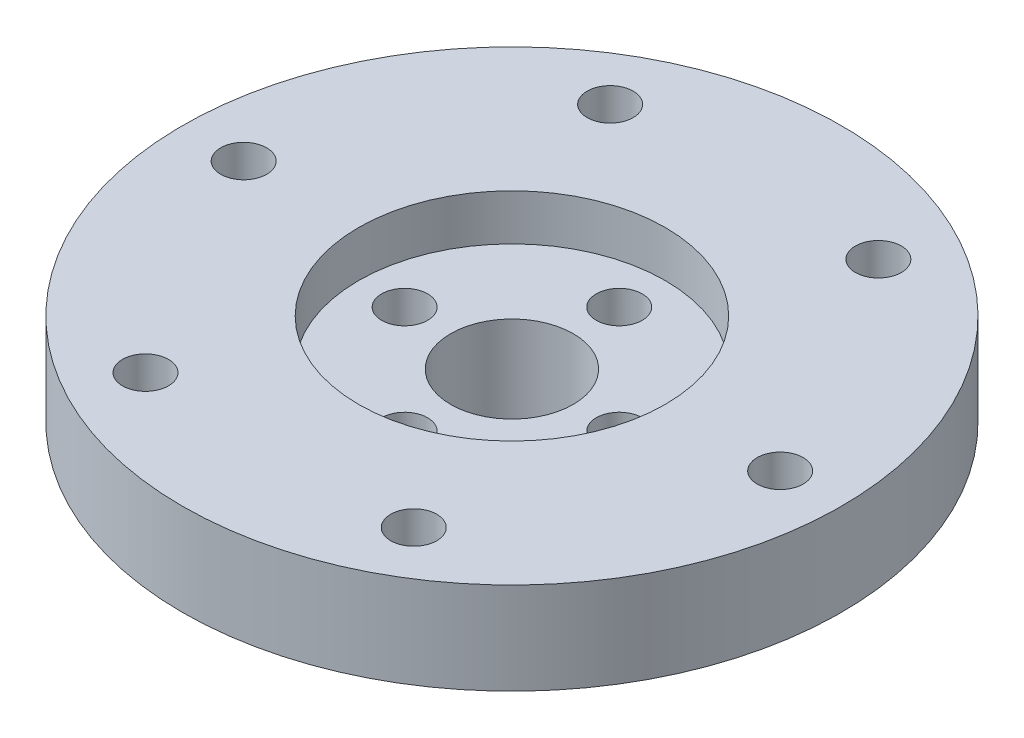
ISO-10303-21;
HEADER;
FILE_DESCRIPTION(('STEP AP214'),'2;1');
FILE_NAME('part.step','',(''),(''),'','','');
FILE_SCHEMA(('AUTOMOTIVE_DESIGN { 1 0 10303 214 1 1 1 1 }'));
ENDSEC;
DATA;
#1=APPLICATION_CONTEXT('core data for automotive mechanical design processes');
#2=APPLICATION_PROTOCOL_DEFINITION('international standard','automotive_design',2000,#1);
#3=PRODUCT_CONTEXT('',#1,'mechanical');
#4=PRODUCT('Part','Part','',(#3));
#5=PRODUCT_RELATED_PRODUCT_CATEGORY('part','',(#4));
#6=PRODUCT_DEFINITION_FORMATION('','',#4);
#7=PRODUCT_DEFINITION_CONTEXT('part definition',#1,'design');
#8=PRODUCT_DEFINITION('design','',#6,#7);
#9=PRODUCT_DEFINITION_SHAPE('','',#8);
#10=(LENGTH_UNIT() NAMED_UNIT(*) SI_UNIT(.MILLI.,.METRE.));
#11=(NAMED_UNIT(*) PLANE_ANGLE_UNIT() SI_UNIT($,.RADIAN.));
#12=(NAMED_UNIT(*) SI_UNIT($,.STERADIAN.) SOLID_ANGLE_UNIT());
#13=UNCERTAINTY_MEASURE_WITH_UNIT(LENGTH_MEASURE(1.E-05),#10,'distance_accuracy_value','');
#14=(GEOMETRIC_REPRESENTATION_CONTEXT(3) GLOBAL_UNCERTAINTY_ASSIGNED_CONTEXT((#13)) GLOBAL_UNIT_ASSIGNED_CONTEXT((#10,
#11,#12)) REPRESENTATION_CONTEXT('',''));
#15=CARTESIAN_POINT('',(0.,0.,0.));
#16=DIRECTION('',(0.,0.,1.));
#17=DIRECTION('',(1.,0.,0.));
#18=AXIS2_PLACEMENT_3D('',#15,#16,#17);
#19=CARTESIAN_POINT('',(0.,0.,0.));
#20=DIRECTION('',(0.,1.,0.));
#21=DIRECTION('',(0.,0.,1.));
#22=AXIS2_PLACEMENT_3D('',#19,#20,#21);
#23=PLANE('',#22);
#24=CARTESIAN_POINT('',(-8.74999999999996,0.,15.1554445662277));
#25=DIRECTION('',(0.,1.,0.));
#26=DIRECTION('',(0.,0.,1.));
#27=AXIS2_PLACEMENT_3D('',#24,#25,#26);
#28=CIRCLE('',#27,1.49999999999999);
#29=CARTESIAN_POINT('',(-8.74999999999996,0.,16.6554445662277));
#30=VERTEX_POINT('',#29);
#31=EDGE_CURVE('E97',#30,#30,#28,.T.);
#32=ORIENTED_EDGE('',*,*,#31,.T.);
#33=EDGE_LOOP('',(#32));
#34=FACE_BOUND('',#33,.T.);
#35=CARTESIAN_POINT('',(8.74999999999996,0.,15.1554445662277));
#36=DIRECTION('',(0.,1.,0.));
#37=DIRECTION('',(0.,0.,-1.));
#38=AXIS2_PLACEMENT_3D('',#35,#36,#37);
#39=CIRCLE('',#38,1.49999999999999);
#40=CARTESIAN_POINT('',(8.74999999999996,0.,13.6554445662277));
#41=VERTEX_POINT('',#40);
#42=EDGE_CURVE('E93',#41,#41,#39,.T.);
#43=ORIENTED_EDGE('',*,*,#42,.T.);
#44=EDGE_LOOP('',(#43));
#45=FACE_BOUND('',#44,.T.);
#46=CARTESIAN_POINT('',(-8.74999999999996,0.,-15.1554445662277));
#47=DIRECTION('',(0.,1.,0.));
#48=DIRECTION('',(0.,0.,-1.));
#49=AXIS2_PLACEMENT_3D('',#46,#47,#48);
#50=CIRCLE('',#49,1.5);
#51=CARTESIAN_POINT('',(-8.74999999999996,0.,-16.6554445662277));
#52=VERTEX_POINT('',#51);
#53=EDGE_CURVE('E89',#52,#52,#50,.T.);
#54=ORIENTED_EDGE('',*,*,#53,.T.);
#55=EDGE_LOOP('',(#54));
#56=FACE_BOUND('',#55,.T.);
#57=CARTESIAN_POINT('',(-17.5,0.,0.));
#58=DIRECTION('',(0.,1.,0.));
#59=DIRECTION('',(0.,0.,-1.));
#60=AXIS2_PLACEMENT_3D('',#57,#58,#59);
#61=CIRCLE('',#60,1.5);
#62=CARTESIAN_POINT('',(-17.5,0.,-1.5));
#63=VERTEX_POINT('',#62);
#64=EDGE_CURVE('E85',#63,#63,#61,.T.);
#65=ORIENTED_EDGE('',*,*,#64,.T.);
#66=EDGE_LOOP('',(#65));
#67=FACE_BOUND('',#66,.T.);
#68=CARTESIAN_POINT('',(17.5,0.,0.));
#69=DIRECTION('',(0.,1.,0.));
#70=DIRECTION('',(0.,0.,1.));
#71=AXIS2_PLACEMENT_3D('',#68,#69,#70);
#72=CIRCLE('',#71,1.5);
#73=CARTESIAN_POINT('',(17.5,0.,1.5));
#74=VERTEX_POINT('',#73);
#75=EDGE_CURVE('E81',#74,#74,#72,.T.);
#76=ORIENTED_EDGE('',*,*,#75,.T.);
#77=EDGE_LOOP('',(#76));
#78=FACE_BOUND('',#77,.T.);
#79=CARTESIAN_POINT('',(8.74999999999996,0.,-15.1554445662277));
#80=DIRECTION('',(0.,1.,0.));
#81=DIRECTION('',(0.,0.,1.));
#82=AXIS2_PLACEMENT_3D('',#79,#80,#81);
#83=CIRCLE('',#82,1.5);
#84=CARTESIAN_POINT('',(8.74999999999996,0.,-13.6554445662277));
#85=VERTEX_POINT('',#84);
#86=EDGE_CURVE('E77',#85,#85,#83,.T.);
#87=ORIENTED_EDGE('',*,*,#86,.T.);
#88=EDGE_LOOP('',(#87));
#89=FACE_BOUND('',#88,.T.);
#90=CARTESIAN_POINT('',(0.,0.,0.));
#91=DIRECTION('',(0.,1.,0.));
#92=DIRECTION('',(0.,0.,1.));
#93=AXIS2_PLACEMENT_3D('',#90,#91,#92);
#94=CIRCLE('',#93,21.5);
#95=CARTESIAN_POINT('',(0.,0.,21.5));
#96=VERTEX_POINT('',#95);
#97=EDGE_CURVE('E49',#96,#96,#94,.T.);
#98=ORIENTED_EDGE('',*,*,#97,.F.);
#99=EDGE_LOOP('',(#98));
#100=FACE_BOUND('',#99,.T.);
#101=CARTESIAN_POINT('',(0.,0.,0.));
#102=DIRECTION('',(0.,1.,0.));
#103=DIRECTION('',(0.,0.,1.));
#104=AXIS2_PLACEMENT_3D('',#101,#102,#103);
#105=CIRCLE('',#104,14.);
#106=CARTESIAN_POINT('',(0.,0.,14.));
#107=VERTEX_POINT('',#106);
#108=EDGE_CURVE('E10',#107,#107,#105,.F.);
#109=ORIENTED_EDGE('',*,*,#108,.F.);
#110=EDGE_LOOP('',(#109));
#111=FACE_BOUND('',#110,.T.);
#112=ADVANCED_FACE('F41',(#34,#45,#56,#67,#78,#89,#100,#111),#23,.F.);
#113=CARTESIAN_POINT('',(0.,3.,0.));
#114=DIRECTION('',(0.,1.,0.));
#115=DIRECTION('',(0.,0.,1.));
#116=AXIS2_PLACEMENT_3D('',#113,#114,#115);
#117=PLANE('',#116);
#118=CARTESIAN_POINT('',(-7.,3.,0.));
#119=DIRECTION('',(0.,1.,0.));
#120=DIRECTION('',(0.,0.,-1.));
#121=AXIS2_PLACEMENT_3D('',#118,#119,#120);
#122=CIRCLE('',#121,1.5);
#123=CARTESIAN_POINT('',(-7.,3.,-1.5));
#124=VERTEX_POINT('',#123);
#125=EDGE_CURVE('E73',#124,#124,#122,.T.);
#126=ORIENTED_EDGE('',*,*,#125,.F.);
#127=EDGE_LOOP('',(#126));
#128=FACE_BOUND('',#127,.T.);
#129=CARTESIAN_POINT('',(7.,3.,0.));
#130=DIRECTION('',(0.,1.,0.));
#131=DIRECTION('',(0.,0.,1.));
#132=AXIS2_PLACEMENT_3D('',#129,#130,#131);
#133=CIRCLE('',#132,1.5);
#134=CARTESIAN_POINT('',(7.,3.,1.5));
#135=VERTEX_POINT('',#134);
#136=EDGE_CURVE('E65',#135,#135,#133,.T.);
#137=ORIENTED_EDGE('',*,*,#136,.F.);
#138=EDGE_LOOP('',(#137));
#139=FACE_BOUND('',#138,.T.);
#140=CARTESIAN_POINT('',(0.,3.,0.));
#141=DIRECTION('',(0.,1.,0.));
#142=DIRECTION('',(0.,0.,1.));
#143=AXIS2_PLACEMENT_3D('',#140,#141,#142);
#144=CIRCLE('',#143,4.);
#145=CARTESIAN_POINT('',(0.,3.,4.));
#146=VERTEX_POINT('',#145);
#147=EDGE_CURVE('E54',#146,#146,#144,.T.);
#148=ORIENTED_EDGE('',*,*,#147,.F.);
#149=EDGE_LOOP('',(#148));
#150=FACE_BOUND('',#149,.T.);
#151=CARTESIAN_POINT('',(0.,3.,-7.));
#152=DIRECTION('',(0.,1.,0.));
#153=DIRECTION('',(0.,0.,1.));
#154=AXIS2_PLACEMENT_3D('',#151,#152,#153);
#155=CIRCLE('',#154,1.5);
#156=CARTESIAN_POINT('',(0.,3.,-5.5));
#157=VERTEX_POINT('',#156);
#158=EDGE_CURVE('E59',#157,#157,#155,.T.);
#159=ORIENTED_EDGE('',*,*,#158,.F.);
#160=EDGE_LOOP('',(#159));
#161=FACE_BOUND('',#160,.T.);
#162=CARTESIAN_POINT('',(0.,3.,7.));
#163=DIRECTION('',(0.,1.,0.));
#164=DIRECTION('',(0.,0.,-1.));
#165=AXIS2_PLACEMENT_3D('',#162,#163,#164);
#166=CIRCLE('',#165,1.5);
#167=CARTESIAN_POINT('',(0.,3.,5.5));
#168=VERTEX_POINT('',#167);
#169=EDGE_CURVE('E69',#168,#168,#166,.T.);
#170=ORIENTED_EDGE('',*,*,#169,.F.);
#171=EDGE_LOOP('',(#170));
#172=FACE_BOUND('',#171,.T.);
#173=CARTESIAN_POINT('',(0.,3.,0.));
#174=DIRECTION('',(0.,1.,0.));
#175=DIRECTION('',(0.,0.,1.));
#176=AXIS2_PLACEMENT_3D('',#173,#174,#175);
#177=CIRCLE('',#176,10.);
#178=CARTESIAN_POINT('',(0.,3.,10.));
#179=VERTEX_POINT('',#178);
#180=EDGE_CURVE('E130',#179,#179,#177,.T.);
#181=ORIENTED_EDGE('',*,*,#180,.T.);
#182=EDGE_LOOP('',(#181));
#183=FACE_BOUND('',#182,.T.);
#184=ADVANCED_FACE('F182',(#128,#139,#150,#161,#172,#183),#117,.T.);
#185=CARTESIAN_POINT('',(0.,3.,0.));
#186=DIRECTION('',(0.,-1.,0.));
#187=DIRECTION('',(0.,0.,-1.));
#188=AXIS2_PLACEMENT_3D('',#185,#186,#187);
#189=CYLINDRICAL_SURFACE('',#188,21.5);
#190=ORIENTED_EDGE('',*,*,#97,.T.);
#191=EDGE_LOOP('',(#190));
#192=FACE_BOUND('',#191,.T.);
#193=CARTESIAN_POINT('',(0.,6.,0.));
#194=DIRECTION('',(0.,1.,0.));
#195=DIRECTION('',(0.,0.,1.));
#196=AXIS2_PLACEMENT_3D('',#193,#194,#195);
#197=CIRCLE('',#196,21.5);
#198=CARTESIAN_POINT('',(0.,6.,21.5));
#199=VERTEX_POINT('',#198);
#200=EDGE_CURVE('E101',#199,#199,#197,.T.);
#201=ORIENTED_EDGE('',*,*,#200,.F.);
#202=EDGE_LOOP('',(#201));
#203=FACE_BOUND('',#202,.T.);
#204=ADVANCED_FACE('F43',(#192,#203),#189,.T.);
#205=CARTESIAN_POINT('',(0.,3.,0.));
#206=DIRECTION('',(0.,-1.,0.));
#207=DIRECTION('',(0.,0.,-1.));
#208=AXIS2_PLACEMENT_3D('',#205,#206,#207);
#209=CYLINDRICAL_SURFACE('',#208,4.);
#210=ORIENTED_EDGE('',*,*,#147,.T.);
#211=EDGE_LOOP('',(#210));
#212=FACE_BOUND('',#211,.T.);
#213=CARTESIAN_POINT('',(0.,-3.,0.));
#214=DIRECTION('',(0.,-1.,0.));
#215=DIRECTION('',(0.,0.,-1.));
#216=AXIS2_PLACEMENT_3D('',#213,#214,#215);
#217=CIRCLE('',#216,4.);
#218=CARTESIAN_POINT('',(0.,-3.,-4.));
#219=VERTEX_POINT('',#218);
#220=EDGE_CURVE('E145',#219,#219,#217,.T.);
#221=ORIENTED_EDGE('',*,*,#220,.T.);
#222=EDGE_LOOP('',(#221));
#223=FACE_BOUND('',#222,.T.);
#224=ADVANCED_FACE('F191',(#212,#223),#209,.F.);
#225=CARTESIAN_POINT('',(0.,3.,-7.));
#226=DIRECTION('',(0.,-1.,0.));
#227=DIRECTION('',(0.,0.,-1.));
#228=AXIS2_PLACEMENT_3D('',#225,#226,#227);
#229=CYLINDRICAL_SURFACE('',#228,1.5);
#230=ORIENTED_EDGE('',*,*,#158,.T.);
#231=EDGE_LOOP('',(#230));
#232=FACE_BOUND('',#231,.T.);
#233=CARTESIAN_POINT('',(0.,-3.,-7.));
#234=DIRECTION('',(0.,-1.,0.));
#235=DIRECTION('',(0.,0.,-1.));
#236=AXIS2_PLACEMENT_3D('',#233,#234,#235);
#237=CIRCLE('',#236,1.5);
#238=CARTESIAN_POINT('',(0.,-3.,-8.5));
#239=VERTEX_POINT('',#238);
#240=EDGE_CURVE('E149',#239,#239,#237,.T.);
#241=ORIENTED_EDGE('',*,*,#240,.T.);
#242=EDGE_LOOP('',(#241));
#243=FACE_BOUND('',#242,.T.);
#244=ADVANCED_FACE('F194',(#232,#243),#229,.F.);
#245=CARTESIAN_POINT('',(7.,3.,0.));
#246=DIRECTION('',(0.,-1.,0.));
#247=DIRECTION('',(0.,0.,-1.));
#248=AXIS2_PLACEMENT_3D('',#245,#246,#247);
#249=CYLINDRICAL_SURFACE('',#248,1.5);
#250=ORIENTED_EDGE('',*,*,#136,.T.);
#251=EDGE_LOOP('',(#250));
#252=FACE_BOUND('',#251,.T.);
#253=CARTESIAN_POINT('',(7.,-3.,0.));
#254=DIRECTION('',(0.,-1.,0.));
#255=DIRECTION('',(0.,0.,-1.));
#256=AXIS2_PLACEMENT_3D('',#253,#254,#255);
#257=CIRCLE('',#256,1.5);
#258=CARTESIAN_POINT('',(7.,-3.,-1.5));
#259=VERTEX_POINT('',#258);
#260=EDGE_CURVE('E141',#259,#259,#257,.T.);
#261=ORIENTED_EDGE('',*,*,#260,.T.);
#262=EDGE_LOOP('',(#261));
#263=FACE_BOUND('',#262,.T.);
#264=ADVANCED_FACE('F198',(#252,#263),#249,.F.);
#265=CARTESIAN_POINT('',(0.,3.,7.));
#266=DIRECTION('',(0.,-1.,0.));
#267=DIRECTION('',(0.,0.,-1.));
#268=AXIS2_PLACEMENT_3D('',#265,#266,#267);
#269=CYLINDRICAL_SURFACE('',#268,1.5);
#270=ORIENTED_EDGE('',*,*,#169,.T.);
#271=EDGE_LOOP('',(#270));
#272=FACE_BOUND('',#271,.T.);
#273=CARTESIAN_POINT('',(0.,-3.,7.));
#274=DIRECTION('',(0.,-1.,0.));
#275=DIRECTION('',(0.,0.,-1.));
#276=AXIS2_PLACEMENT_3D('',#273,#274,#275);
#277=CIRCLE('',#276,1.5);
#278=CARTESIAN_POINT('',(0.,-3.,5.5));
#279=VERTEX_POINT('',#278);
#280=EDGE_CURVE('E157',#279,#279,#277,.T.);
#281=ORIENTED_EDGE('',*,*,#280,.T.);
#282=EDGE_LOOP('',(#281));
#283=FACE_BOUND('',#282,.T.);
#284=ADVANCED_FACE('F162',(#272,#283),#269,.F.);
#285=CARTESIAN_POINT('',(-7.,3.,0.));
#286=DIRECTION('',(0.,-1.,0.));
#287=DIRECTION('',(0.,0.,-1.));
#288=AXIS2_PLACEMENT_3D('',#285,#286,#287);
#289=CYLINDRICAL_SURFACE('',#288,1.5);
#290=ORIENTED_EDGE('',*,*,#125,.T.);
#291=EDGE_LOOP('',(#290));
#292=FACE_BOUND('',#291,.T.);
#293=CARTESIAN_POINT('',(-7.,-3.,0.));
#294=DIRECTION('',(0.,-1.,0.));
#295=DIRECTION('',(0.,0.,-1.));
#296=AXIS2_PLACEMENT_3D('',#293,#294,#295);
#297=CIRCLE('',#296,1.5);
#298=CARTESIAN_POINT('',(-7.,-3.,-1.5));
#299=VERTEX_POINT('',#298);
#300=EDGE_CURVE('E153',#299,#299,#297,.T.);
#301=ORIENTED_EDGE('',*,*,#300,.T.);
#302=EDGE_LOOP('',(#301));
#303=FACE_BOUND('',#302,.T.);
#304=ADVANCED_FACE('F205',(#292,#303),#289,.F.);
#305=CARTESIAN_POINT('',(8.74999999999996,3.,-15.1554445662277));
#306=DIRECTION('',(0.,-1.,0.));
#307=DIRECTION('',(0.,0.,-1.));
#308=AXIS2_PLACEMENT_3D('',#305,#306,#307);
#309=CYLINDRICAL_SURFACE('',#308,1.5);
#310=ORIENTED_EDGE('',*,*,#86,.F.);
#311=EDGE_LOOP('',(#310));
#312=FACE_BOUND('',#311,.T.);
#313=CARTESIAN_POINT('',(8.74999999999996,6.,-15.1554445662277));
#314=DIRECTION('',(0.,1.,0.));
#315=DIRECTION('',(0.,0.,1.));
#316=AXIS2_PLACEMENT_3D('',#313,#314,#315);
#317=CIRCLE('',#316,1.5);
#318=CARTESIAN_POINT('',(8.74999999999996,6.,-13.6554445662277));
#319=VERTEX_POINT('',#318);
#320=EDGE_CURVE('E121',#319,#319,#317,.T.);
#321=ORIENTED_EDGE('',*,*,#320,.T.);
#322=EDGE_LOOP('',(#321));
#323=FACE_BOUND('',#322,.T.);
#324=ADVANCED_FACE('F209',(#312,#323),#309,.F.);
#325=CARTESIAN_POINT('',(17.5,3.,0.));
#326=DIRECTION('',(0.,-1.,0.));
#327=DIRECTION('',(0.,0.,-1.));
#328=AXIS2_PLACEMENT_3D('',#325,#326,#327);
#329=CYLINDRICAL_SURFACE('',#328,1.5);
#330=ORIENTED_EDGE('',*,*,#75,.F.);
#331=EDGE_LOOP('',(#330));
#332=FACE_BOUND('',#331,.T.);
#333=CARTESIAN_POINT('',(17.5,6.,0.));
#334=DIRECTION('',(0.,1.,0.));
#335=DIRECTION('',(0.,0.,1.));
#336=AXIS2_PLACEMENT_3D('',#333,#334,#335);
#337=CIRCLE('',#336,1.5);
#338=CARTESIAN_POINT('',(17.5,6.,1.5));
#339=VERTEX_POINT('',#338);
#340=EDGE_CURVE('E117',#339,#339,#337,.T.);
#341=ORIENTED_EDGE('',*,*,#340,.T.);
#342=EDGE_LOOP('',(#341));
#343=FACE_BOUND('',#342,.T.);
#344=ADVANCED_FACE('F213',(#332,#343),#329,.F.);
#345=CARTESIAN_POINT('',(-17.5,3.,0.));
#346=DIRECTION('',(0.,-1.,0.));
#347=DIRECTION('',(0.,0.,-1.));
#348=AXIS2_PLACEMENT_3D('',#345,#346,#347);
#349=CYLINDRICAL_SURFACE('',#348,1.5);
#350=ORIENTED_EDGE('',*,*,#64,.F.);
#351=EDGE_LOOP('',(#350));
#352=FACE_BOUND('',#351,.T.);
#353=CARTESIAN_POINT('',(-17.5,6.,0.));
#354=DIRECTION('',(0.,1.,0.));
#355=DIRECTION('',(0.,0.,1.));
#356=AXIS2_PLACEMENT_3D('',#353,#354,#355);
#357=CIRCLE('',#356,1.5);
#358=CARTESIAN_POINT('',(-17.5,6.,1.5));
#359=VERTEX_POINT('',#358);
#360=EDGE_CURVE('E105',#359,#359,#357,.T.);
#361=ORIENTED_EDGE('',*,*,#360,.T.);
#362=EDGE_LOOP('',(#361));
#363=FACE_BOUND('',#362,.T.);
#364=ADVANCED_FACE('F217',(#352,#363),#349,.F.);
#365=CARTESIAN_POINT('',(-8.74999999999996,3.,-15.1554445662277));
#366=DIRECTION('',(0.,-1.,0.));
#367=DIRECTION('',(0.,0.,-1.));
#368=AXIS2_PLACEMENT_3D('',#365,#366,#367);
#369=CYLINDRICAL_SURFACE('',#368,1.5);
#370=ORIENTED_EDGE('',*,*,#53,.F.);
#371=EDGE_LOOP('',(#370));
#372=FACE_BOUND('',#371,.T.);
#373=CARTESIAN_POINT('',(-8.74999999999996,6.,-15.1554445662277));
#374=DIRECTION('',(0.,1.,0.));
#375=DIRECTION('',(0.,0.,1.));
#376=AXIS2_PLACEMENT_3D('',#373,#374,#375);
#377=CIRCLE('',#376,1.5);
#378=CARTESIAN_POINT('',(-8.74999999999996,6.,-13.6554445662277));
#379=VERTEX_POINT('',#378);
#380=EDGE_CURVE('E125',#379,#379,#377,.T.);
#381=ORIENTED_EDGE('',*,*,#380,.T.);
#382=EDGE_LOOP('',(#381));
#383=FACE_BOUND('',#382,.T.);
#384=ADVANCED_FACE('F221',(#372,#383),#369,.F.);
#385=CARTESIAN_POINT('',(8.74999999999996,3.,15.1554445662277));
#386=DIRECTION('',(0.,-1.,0.));
#387=DIRECTION('',(0.,0.,-1.));
#388=AXIS2_PLACEMENT_3D('',#385,#386,#387);
#389=CYLINDRICAL_SURFACE('',#388,1.49999999999999);
#390=ORIENTED_EDGE('',*,*,#42,.F.);
#391=EDGE_LOOP('',(#390));
#392=FACE_BOUND('',#391,.T.);
#393=CARTESIAN_POINT('',(8.74999999999996,6.,15.1554445662277));
#394=DIRECTION('',(0.,1.,0.));
#395=DIRECTION('',(0.,0.,1.));
#396=AXIS2_PLACEMENT_3D('',#393,#394,#395);
#397=CIRCLE('',#396,1.49999999999999);
#398=CARTESIAN_POINT('',(8.74999999999996,6.,16.6554445662277));
#399=VERTEX_POINT('',#398);
#400=EDGE_CURVE('E113',#399,#399,#397,.T.);
#401=ORIENTED_EDGE('',*,*,#400,.T.);
#402=EDGE_LOOP('',(#401));
#403=FACE_BOUND('',#402,.T.);
#404=ADVANCED_FACE('F225',(#392,#403),#389,.F.);
#405=CARTESIAN_POINT('',(-8.74999999999996,3.,15.1554445662277));
#406=DIRECTION('',(0.,-1.,0.));
#407=DIRECTION('',(0.,0.,-1.));
#408=AXIS2_PLACEMENT_3D('',#405,#406,#407);
#409=CYLINDRICAL_SURFACE('',#408,1.49999999999999);
#410=ORIENTED_EDGE('',*,*,#31,.F.);
#411=EDGE_LOOP('',(#410));
#412=FACE_BOUND('',#411,.T.);
#413=CARTESIAN_POINT('',(-8.74999999999996,6.,15.1554445662277));
#414=DIRECTION('',(0.,1.,0.));
#415=DIRECTION('',(0.,0.,1.));
#416=AXIS2_PLACEMENT_3D('',#413,#414,#415);
#417=CIRCLE('',#416,1.49999999999999);
#418=CARTESIAN_POINT('',(-8.74999999999996,6.,16.6554445662277));
#419=VERTEX_POINT('',#418);
#420=EDGE_CURVE('E109',#419,#419,#417,.T.);
#421=ORIENTED_EDGE('',*,*,#420,.T.);
#422=EDGE_LOOP('',(#421));
#423=FACE_BOUND('',#422,.T.);
#424=ADVANCED_FACE('F229',(#412,#423),#409,.F.);
#425=CARTESIAN_POINT('',(0.,6.,0.));
#426=DIRECTION('',(0.,1.,0.));
#427=DIRECTION('',(0.,0.,1.));
#428=AXIS2_PLACEMENT_3D('',#425,#426,#427);
#429=PLANE('',#428);
#430=ORIENTED_EDGE('',*,*,#380,.F.);
#431=EDGE_LOOP('',(#430));
#432=FACE_BOUND('',#431,.T.);
#433=ORIENTED_EDGE('',*,*,#340,.F.);
#434=EDGE_LOOP('',(#433));
#435=FACE_BOUND('',#434,.T.);
#436=ORIENTED_EDGE('',*,*,#420,.F.);
#437=EDGE_LOOP('',(#436));
#438=FACE_BOUND('',#437,.T.);
#439=ORIENTED_EDGE('',*,*,#200,.T.);
#440=EDGE_LOOP('',(#439));
#441=FACE_BOUND('',#440,.T.);
#442=ORIENTED_EDGE('',*,*,#360,.F.);
#443=EDGE_LOOP('',(#442));
#444=FACE_BOUND('',#443,.T.);
#445=ORIENTED_EDGE('',*,*,#400,.F.);
#446=EDGE_LOOP('',(#445));
#447=FACE_BOUND('',#446,.T.);
#448=ORIENTED_EDGE('',*,*,#320,.F.);
#449=EDGE_LOOP('',(#448));
#450=FACE_BOUND('',#449,.T.);
#451=CARTESIAN_POINT('',(0.,6.,0.));
#452=DIRECTION('',(0.,1.,0.));
#453=DIRECTION('',(0.,0.,1.));
#454=AXIS2_PLACEMENT_3D('',#451,#452,#453);
#455=CIRCLE('',#454,10.);
#456=CARTESIAN_POINT('',(0.,6.,10.));
#457=VERTEX_POINT('',#456);
#458=EDGE_CURVE('E129',#457,#457,#455,.T.);
#459=ORIENTED_EDGE('',*,*,#458,.F.);
#460=EDGE_LOOP('',(#459));
#461=FACE_BOUND('',#460,.T.);
#462=ADVANCED_FACE('F176',(#432,#435,#438,#441,#444,#447,#450,#461),#429,.T.);
#463=CARTESIAN_POINT('',(0.,6.,0.));
#464=DIRECTION('',(0.,-1.,0.));
#465=DIRECTION('',(0.,0.,-1.));
#466=AXIS2_PLACEMENT_3D('',#463,#464,#465);
#467=CYLINDRICAL_SURFACE('',#466,10.);
#468=ORIENTED_EDGE('',*,*,#458,.T.);
#469=EDGE_LOOP('',(#468));
#470=FACE_BOUND('',#469,.T.);
#471=ORIENTED_EDGE('',*,*,#180,.F.);
#472=EDGE_LOOP('',(#471));
#473=FACE_BOUND('',#472,.T.);
#474=ADVANCED_FACE('F167',(#470,#473),#467,.F.);
#475=CARTESIAN_POINT('',(0.,-3.,0.));
#476=DIRECTION('',(0.,-1.,0.));
#477=DIRECTION('',(0.,0.,-1.));
#478=AXIS2_PLACEMENT_3D('',#475,#476,#477);
#479=PLANE('',#478);
#480=ORIENTED_EDGE('',*,*,#300,.F.);
#481=EDGE_LOOP('',(#480));
#482=FACE_BOUND('',#481,.T.);
#483=ORIENTED_EDGE('',*,*,#220,.F.);
#484=EDGE_LOOP('',(#483));
#485=FACE_BOUND('',#484,.T.);
#486=CARTESIAN_POINT('',(0.,-3.,0.));
#487=DIRECTION('',(0.,-1.,0.));
#488=DIRECTION('',(0.,0.,-1.));
#489=AXIS2_PLACEMENT_3D('',#486,#487,#488);
#490=CIRCLE('',#489,14.);
#491=CARTESIAN_POINT('',(0.,-3.,-14.));
#492=VERTEX_POINT('',#491);
#493=EDGE_CURVE('E134',#492,#492,#490,.T.);
#494=ORIENTED_EDGE('',*,*,#493,.T.);
#495=EDGE_LOOP('',(#494));
#496=FACE_BOUND('',#495,.T.);
#497=ORIENTED_EDGE('',*,*,#260,.F.);
#498=EDGE_LOOP('',(#497));
#499=FACE_BOUND('',#498,.T.);
#500=ORIENTED_EDGE('',*,*,#240,.F.);
#501=EDGE_LOOP('',(#500));
#502=FACE_BOUND('',#501,.T.);
#503=ORIENTED_EDGE('',*,*,#280,.F.);
#504=EDGE_LOOP('',(#503));
#505=FACE_BOUND('',#504,.T.);
#506=ADVANCED_FACE('F164',(#482,#485,#496,#499,#502,#505),#479,.T.);
#507=CARTESIAN_POINT('',(0.,-3.,0.));
#508=DIRECTION('',(0.,1.,0.));
#509=DIRECTION('',(0.,0.,1.));
#510=AXIS2_PLACEMENT_3D('',#507,#508,#509);
#511=CYLINDRICAL_SURFACE('',#510,14.);
#512=ORIENTED_EDGE('',*,*,#493,.F.);
#513=EDGE_LOOP('',(#512));
#514=FACE_BOUND('',#513,.T.);
#515=ORIENTED_EDGE('',*,*,#108,.T.);
#516=EDGE_LOOP('',(#515));
#517=FACE_BOUND('',#516,.T.);
#518=ADVANCED_FACE('F166',(#514,#517),#511,.T.);
#519=CLOSED_SHELL('',(#112,#184,#204,#224,#244,#264,#284,#304,#324,#344,#364,#384,#404,#424,
#462,#474,#506,#518));
#520=MANIFOLD_SOLID_BREP('B2',#519);
#521=ADVANCED_BREP_SHAPE_REPRESENTATION('',(#18,#520),#14);
#522=SHAPE_DEFINITION_REPRESENTATION(#9,#521);
ENDSEC;
END-ISO-10303-21;
